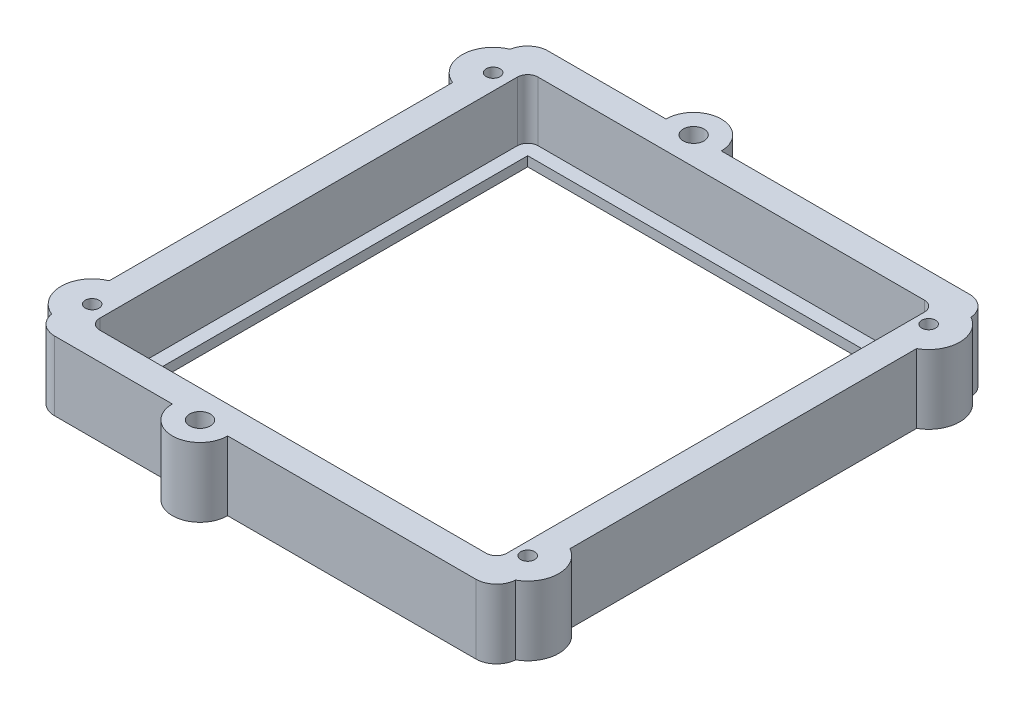
ISO-10303-21;
HEADER;
FILE_DESCRIPTION(('STEP AP214'),'2;1');
FILE_NAME('part.step','',(''),(''),'','','');
FILE_SCHEMA(('AUTOMOTIVE_DESIGN { 1 0 10303 214 1 1 1 1 }'));
ENDSEC;
DATA;
#1=APPLICATION_CONTEXT('core data for automotive mechanical design processes');
#2=APPLICATION_PROTOCOL_DEFINITION('international standard','automotive_design',2000,#1);
#3=PRODUCT_CONTEXT('',#1,'mechanical');
#4=PRODUCT('Part','Part','',(#3));
#5=PRODUCT_RELATED_PRODUCT_CATEGORY('part','',(#4));
#6=PRODUCT_DEFINITION_FORMATION('','',#4);
#7=PRODUCT_DEFINITION_CONTEXT('part definition',#1,'design');
#8=PRODUCT_DEFINITION('design','',#6,#7);
#9=PRODUCT_DEFINITION_SHAPE('','',#8);
#10=(LENGTH_UNIT() NAMED_UNIT(*) SI_UNIT(.MILLI.,.METRE.));
#11=(NAMED_UNIT(*) PLANE_ANGLE_UNIT() SI_UNIT($,.RADIAN.));
#12=(NAMED_UNIT(*) SI_UNIT($,.STERADIAN.) SOLID_ANGLE_UNIT());
#13=UNCERTAINTY_MEASURE_WITH_UNIT(LENGTH_MEASURE(1.E-05),#10,'distance_accuracy_value','');
#14=(GEOMETRIC_REPRESENTATION_CONTEXT(3) GLOBAL_UNCERTAINTY_ASSIGNED_CONTEXT((#13)) GLOBAL_UNIT_ASSIGNED_CONTEXT((#10,
#11,#12)) REPRESENTATION_CONTEXT('',''));
#15=CARTESIAN_POINT('',(0.,0.,0.));
#16=DIRECTION('',(0.,0.,1.));
#17=DIRECTION('',(1.,0.,0.));
#18=AXIS2_PLACEMENT_3D('',#15,#16,#17);
#19=CARTESIAN_POINT('',(1.50000000000001,10.,61.9));
#20=DIRECTION('',(0.,-1.,0.));
#21=DIRECTION('',(0.,0.,-1.));
#22=AXIS2_PLACEMENT_3D('',#19,#20,#21);
#23=CYLINDRICAL_SURFACE('',#22,1.5);
#24=DIRECTION('',(0.,-1.,0.));
#25=VECTOR('',#24,1.);
#26=CARTESIAN_POINT('',(1.50000000000002,10.,63.4));
#27=LINE('',#26,#25);
#28=CARTESIAN_POINT('',(1.50000000000002,10.,63.4));
#29=VERTEX_POINT('',#28);
#30=CARTESIAN_POINT('',(1.50000000000002,1.4,63.4));
#31=VERTEX_POINT('',#30);
#32=EDGE_CURVE('E337',#29,#31,#27,.T.);
#33=ORIENTED_EDGE('',*,*,#32,.T.);
#34=CARTESIAN_POINT('',(1.50000000000001,1.4,61.9));
#35=DIRECTION('',(0.,-1.,0.));
#36=DIRECTION('',(0.,0.,-1.));
#37=AXIS2_PLACEMENT_3D('',#34,#35,#36);
#38=CIRCLE('',#37,1.5);
#39=CARTESIAN_POINT('',(0.,1.4,61.9));
#40=VERTEX_POINT('',#39);
#41=EDGE_CURVE('E284',#31,#40,#38,.T.);
#42=ORIENTED_EDGE('',*,*,#41,.T.);
#43=DIRECTION('',(0.,-1.,0.));
#44=VECTOR('',#43,1.);
#45=CARTESIAN_POINT('',(0.,10.,61.9));
#46=LINE('',#45,#44);
#47=CARTESIAN_POINT('',(0.,10.,61.9));
#48=VERTEX_POINT('',#47);
#49=EDGE_CURVE('E316',#48,#40,#46,.T.);
#50=ORIENTED_EDGE('',*,*,#49,.F.);
#51=CARTESIAN_POINT('',(1.50000000000001,10.,61.9));
#52=DIRECTION('',(0.,1.,0.));
#53=DIRECTION('',(0.,0.,1.));
#54=AXIS2_PLACEMENT_3D('',#51,#52,#53);
#55=CIRCLE('',#54,1.5);
#56=EDGE_CURVE('E297',#48,#29,#55,.T.);
#57=ORIENTED_EDGE('',*,*,#56,.T.);
#58=EDGE_LOOP('',(#33,#42,#50,#57));
#59=FACE_BOUND('',#58,.T.);
#60=ADVANCED_FACE('F39',(#59),#23,.F.);
#61=CARTESIAN_POINT('',(1.50000000000002,10.,63.4));
#62=DIRECTION('',(0.,0.,-1.));
#63=DIRECTION('',(-1.,0.,0.));
#64=AXIS2_PLACEMENT_3D('',#61,#62,#63);
#65=PLANE('',#64);
#66=DIRECTION('',(0.,-1.,0.));
#67=VECTOR('',#66,1.);
#68=CARTESIAN_POINT('',(57.3857142857141,10.,63.4));
#69=LINE('',#68,#67);
#70=CARTESIAN_POINT('',(57.3857142857141,10.,63.4));
#71=VERTEX_POINT('',#70);
#72=CARTESIAN_POINT('',(57.3857142857141,1.4,63.4));
#73=VERTEX_POINT('',#72);
#74=EDGE_CURVE('E334',#71,#73,#69,.T.);
#75=ORIENTED_EDGE('',*,*,#74,.T.);
#76=DIRECTION('',(-1.,0.,0.));
#77=VECTOR('',#76,1.);
#78=CARTESIAN_POINT('',(0.,1.4,63.4));
#79=LINE('',#78,#77);
#80=EDGE_CURVE('E272',#73,#31,#79,.T.);
#81=ORIENTED_EDGE('',*,*,#80,.T.);
#82=ORIENTED_EDGE('',*,*,#32,.F.);
#83=DIRECTION('',(1.,0.,0.));
#84=VECTOR('',#83,1.);
#85=CARTESIAN_POINT('',(1.50000000000002,10.,63.4));
#86=LINE('',#85,#84);
#87=EDGE_CURVE('E301',#29,#71,#86,.T.);
#88=ORIENTED_EDGE('',*,*,#87,.T.);
#89=EDGE_LOOP('',(#75,#81,#82,#88));
#90=FACE_BOUND('',#89,.T.);
#91=ADVANCED_FACE('F556',(#90),#65,.T.);
#92=CARTESIAN_POINT('',(57.3857142857141,10.,61.9));
#93=DIRECTION('',(0.,-1.,0.));
#94=DIRECTION('',(0.,0.,-1.));
#95=AXIS2_PLACEMENT_3D('',#92,#93,#94);
#96=CYLINDRICAL_SURFACE('',#95,1.50000000000001);
#97=DIRECTION('',(0.,-1.,0.));
#98=VECTOR('',#97,1.);
#99=CARTESIAN_POINT('',(58.8857142857141,10.,61.9));
#100=LINE('',#99,#98);
#101=CARTESIAN_POINT('',(58.8857142857141,10.,61.9));
#102=VERTEX_POINT('',#101);
#103=CARTESIAN_POINT('',(58.8857142857141,1.4,61.9));
#104=VERTEX_POINT('',#103);
#105=EDGE_CURVE('E331',#102,#104,#100,.T.);
#106=ORIENTED_EDGE('',*,*,#105,.T.);
#107=CARTESIAN_POINT('',(57.3857142857141,1.4,61.9));
#108=DIRECTION('',(0.,-1.,0.));
#109=DIRECTION('',(0.,0.,-1.));
#110=AXIS2_PLACEMENT_3D('',#107,#108,#109);
#111=CIRCLE('',#110,1.50000000000001);
#112=EDGE_CURVE('E281',#104,#73,#111,.T.);
#113=ORIENTED_EDGE('',*,*,#112,.T.);
#114=ORIENTED_EDGE('',*,*,#74,.F.);
#115=CARTESIAN_POINT('',(57.3857142857141,10.,61.9));
#116=DIRECTION('',(0.,1.,0.));
#117=DIRECTION('',(0.,0.,1.));
#118=AXIS2_PLACEMENT_3D('',#115,#116,#117);
#119=CIRCLE('',#118,1.50000000000001);
#120=EDGE_CURVE('E303',#71,#102,#119,.T.);
#121=ORIENTED_EDGE('',*,*,#120,.T.);
#122=EDGE_LOOP('',(#106,#113,#114,#121));
#123=FACE_BOUND('',#122,.T.);
#124=ADVANCED_FACE('F562',(#123),#96,.F.);
#125=CARTESIAN_POINT('',(58.8857142857141,10.,1.5));
#126=DIRECTION('',(-1.,0.,0.));
#127=DIRECTION('',(0.,0.,1.));
#128=AXIS2_PLACEMENT_3D('',#125,#126,#127);
#129=PLANE('',#128);
#130=DIRECTION('',(0.,-1.,0.));
#131=VECTOR('',#130,1.);
#132=CARTESIAN_POINT('',(58.8857142857141,10.,1.5));
#133=LINE('',#132,#131);
#134=CARTESIAN_POINT('',(58.8857142857141,10.,1.5));
#135=VERTEX_POINT('',#134);
#136=CARTESIAN_POINT('',(58.8857142857141,1.4,1.5));
#137=VERTEX_POINT('',#136);
#138=EDGE_CURVE('E328',#135,#137,#133,.T.);
#139=ORIENTED_EDGE('',*,*,#138,.T.);
#140=DIRECTION('',(0.,0.,1.));
#141=VECTOR('',#140,1.);
#142=CARTESIAN_POINT('',(58.8857142857141,1.4,63.4));
#143=LINE('',#142,#141);
#144=EDGE_CURVE('E269',#137,#104,#143,.T.);
#145=ORIENTED_EDGE('',*,*,#144,.T.);
#146=ORIENTED_EDGE('',*,*,#105,.F.);
#147=DIRECTION('',(0.,0.,-1.));
#148=VECTOR('',#147,1.);
#149=CARTESIAN_POINT('',(58.8857142857141,10.,1.5));
#150=LINE('',#149,#148);
#151=EDGE_CURVE('E305',#102,#135,#150,.T.);
#152=ORIENTED_EDGE('',*,*,#151,.T.);
#153=EDGE_LOOP('',(#139,#145,#146,#152));
#154=FACE_BOUND('',#153,.T.);
#155=ADVANCED_FACE('F656',(#154),#129,.T.);
#156=CARTESIAN_POINT('',(57.3857142857141,10.,1.5));
#157=DIRECTION('',(0.,-1.,0.));
#158=DIRECTION('',(0.,0.,-1.));
#159=AXIS2_PLACEMENT_3D('',#156,#157,#158);
#160=CYLINDRICAL_SURFACE('',#159,1.5);
#161=DIRECTION('',(0.,-1.,0.));
#162=VECTOR('',#161,1.);
#163=CARTESIAN_POINT('',(57.3857142857141,10.,0.));
#164=LINE('',#163,#162);
#165=CARTESIAN_POINT('',(57.3857142857141,10.,0.));
#166=VERTEX_POINT('',#165);
#167=CARTESIAN_POINT('',(57.3857142857141,1.4,0.));
#168=VERTEX_POINT('',#167);
#169=EDGE_CURVE('E325',#166,#168,#164,.T.);
#170=ORIENTED_EDGE('',*,*,#169,.T.);
#171=CARTESIAN_POINT('',(57.3857142857141,1.4,1.5));
#172=DIRECTION('',(0.,-1.,0.));
#173=DIRECTION('',(0.,0.,-1.));
#174=AXIS2_PLACEMENT_3D('',#171,#172,#173);
#175=CIRCLE('',#174,1.5);
#176=EDGE_CURVE('E278',#168,#137,#175,.T.);
#177=ORIENTED_EDGE('',*,*,#176,.T.);
#178=ORIENTED_EDGE('',*,*,#138,.F.);
#179=CARTESIAN_POINT('',(57.3857142857141,10.,1.5));
#180=DIRECTION('',(0.,1.,0.));
#181=DIRECTION('',(0.,0.,-1.));
#182=AXIS2_PLACEMENT_3D('',#179,#180,#181);
#183=CIRCLE('',#182,1.5);
#184=EDGE_CURVE('E307',#135,#166,#183,.T.);
#185=ORIENTED_EDGE('',*,*,#184,.T.);
#186=EDGE_LOOP('',(#170,#177,#178,#185));
#187=FACE_BOUND('',#186,.T.);
#188=ADVANCED_FACE('F652',(#187),#160,.F.);
#189=CARTESIAN_POINT('',(1.50000000000001,10.,0.));
#190=DIRECTION('',(0.,0.,1.));
#191=DIRECTION('',(1.,0.,0.));
#192=AXIS2_PLACEMENT_3D('',#189,#190,#191);
#193=PLANE('',#192);
#194=DIRECTION('',(0.,-1.,0.));
#195=VECTOR('',#194,1.);
#196=CARTESIAN_POINT('',(1.50000000000001,10.,0.));
#197=LINE('',#196,#195);
#198=CARTESIAN_POINT('',(1.50000000000001,10.,0.));
#199=VERTEX_POINT('',#198);
#200=CARTESIAN_POINT('',(1.5,1.4,0.));
#201=VERTEX_POINT('',#200);
#202=EDGE_CURVE('E322',#199,#201,#197,.T.);
#203=ORIENTED_EDGE('',*,*,#202,.T.);
#204=DIRECTION('',(1.,0.,0.));
#205=VECTOR('',#204,1.);
#206=CARTESIAN_POINT('',(0.,1.4,0.));
#207=LINE('',#206,#205);
#208=EDGE_CURVE('E263',#201,#168,#207,.T.);
#209=ORIENTED_EDGE('',*,*,#208,.T.);
#210=ORIENTED_EDGE('',*,*,#169,.F.);
#211=DIRECTION('',(-1.,0.,0.));
#212=VECTOR('',#211,1.);
#213=CARTESIAN_POINT('',(1.50000000000001,10.,0.));
#214=LINE('',#213,#212);
#215=EDGE_CURVE('E309',#166,#199,#214,.T.);
#216=ORIENTED_EDGE('',*,*,#215,.T.);
#217=EDGE_LOOP('',(#203,#209,#210,#216));
#218=FACE_BOUND('',#217,.T.);
#219=ADVANCED_FACE('F648',(#218),#193,.T.);
#220=CARTESIAN_POINT('',(1.5,10.,1.5));
#221=DIRECTION('',(0.,-1.,0.));
#222=DIRECTION('',(0.,0.,-1.));
#223=AXIS2_PLACEMENT_3D('',#220,#221,#222);
#224=CYLINDRICAL_SURFACE('',#223,1.5);
#225=DIRECTION('',(0.,-1.,0.));
#226=VECTOR('',#225,1.);
#227=CARTESIAN_POINT('',(0.,10.,1.50000000000001));
#228=LINE('',#227,#226);
#229=CARTESIAN_POINT('',(0.,10.,1.50000000000001));
#230=VERTEX_POINT('',#229);
#231=CARTESIAN_POINT('',(0.,1.4,1.50000000000001));
#232=VERTEX_POINT('',#231);
#233=EDGE_CURVE('E319',#230,#232,#228,.T.);
#234=ORIENTED_EDGE('',*,*,#233,.T.);
#235=CARTESIAN_POINT('',(1.5,1.4,1.5));
#236=DIRECTION('',(0.,-1.,0.));
#237=DIRECTION('',(0.,0.,-1.));
#238=AXIS2_PLACEMENT_3D('',#235,#236,#237);
#239=CIRCLE('',#238,1.5);
#240=EDGE_CURVE('E275',#232,#201,#239,.T.);
#241=ORIENTED_EDGE('',*,*,#240,.T.);
#242=ORIENTED_EDGE('',*,*,#202,.F.);
#243=CARTESIAN_POINT('',(1.5,10.,1.5));
#244=DIRECTION('',(0.,1.,0.));
#245=DIRECTION('',(0.,0.,1.));
#246=AXIS2_PLACEMENT_3D('',#243,#244,#245);
#247=CIRCLE('',#246,1.5);
#248=EDGE_CURVE('E311',#199,#230,#247,.T.);
#249=ORIENTED_EDGE('',*,*,#248,.T.);
#250=EDGE_LOOP('',(#234,#241,#242,#249));
#251=FACE_BOUND('',#250,.T.);
#252=ADVANCED_FACE('F644',(#251),#224,.F.);
#253=CARTESIAN_POINT('',(0.,10.,1.50000000000001));
#254=DIRECTION('',(1.,0.,0.));
#255=DIRECTION('',(0.,0.,-1.));
#256=AXIS2_PLACEMENT_3D('',#253,#254,#255);
#257=PLANE('',#256);
#258=ORIENTED_EDGE('',*,*,#49,.T.);
#259=DIRECTION('',(0.,0.,-1.));
#260=VECTOR('',#259,1.);
#261=CARTESIAN_POINT('',(0.,1.4,1.50000000000001));
#262=LINE('',#261,#260);
#263=EDGE_CURVE('E452',#40,#232,#262,.T.);
#264=ORIENTED_EDGE('',*,*,#263,.T.);
#265=ORIENTED_EDGE('',*,*,#233,.F.);
#266=DIRECTION('',(0.,0.,1.));
#267=VECTOR('',#266,1.);
#268=CARTESIAN_POINT('',(0.,10.,1.50000000000001));
#269=LINE('',#268,#267);
#270=EDGE_CURVE('E314',#230,#48,#269,.T.);
#271=ORIENTED_EDGE('',*,*,#270,.T.);
#272=EDGE_LOOP('',(#258,#264,#265,#271));
#273=FACE_BOUND('',#272,.T.);
#274=ADVANCED_FACE('F586',(#273),#257,.T.);
#275=CARTESIAN_POINT('',(-2.3,10.,2.7));
#276=DIRECTION('',(0.,1.,0.));
#277=DIRECTION('',(0.,0.,1.));
#278=AXIS2_PLACEMENT_3D('',#275,#276,#277);
#279=PLANE('',#278);
#280=CARTESIAN_POINT('',(20.,10.,67.4));
#281=DIRECTION('',(0.,1.,0.));
#282=DIRECTION('',(0.,0.,1.));
#283=AXIS2_PLACEMENT_3D('',#280,#281,#282);
#284=CIRCLE('',#283,1.5);
#285=CARTESIAN_POINT('',(20.,10.,68.9));
#286=VERTEX_POINT('',#285);
#287=EDGE_CURVE('E294',#286,#286,#284,.T.);
#288=ORIENTED_EDGE('',*,*,#287,.F.);
#289=EDGE_LOOP('',(#288));
#290=FACE_BOUND('',#289,.T.);
#291=CARTESIAN_POINT('',(60.7,10.,60.7));
#292=DIRECTION('',(0.,1.,0.));
#293=DIRECTION('',(0.,0.,1.));
#294=AXIS2_PLACEMENT_3D('',#291,#292,#293);
#295=CIRCLE('',#294,0.999999999999998);
#296=CARTESIAN_POINT('',(60.7,10.,61.7));
#297=VERTEX_POINT('',#296);
#298=EDGE_CURVE('E347',#297,#297,#295,.T.);
#299=ORIENTED_EDGE('',*,*,#298,.F.);
#300=EDGE_LOOP('',(#299));
#301=FACE_BOUND('',#300,.T.);
#302=CARTESIAN_POINT('',(-2.3,10.,2.7));
#303=DIRECTION('',(0.,1.,0.));
#304=DIRECTION('',(0.,0.,1.));
#305=AXIS2_PLACEMENT_3D('',#302,#303,#304);
#306=CIRCLE('',#305,1.);
#307=CARTESIAN_POINT('',(-2.3,10.,3.7));
#308=VERTEX_POINT('',#307);
#309=EDGE_CURVE('E359',#308,#308,#306,.T.);
#310=ORIENTED_EDGE('',*,*,#309,.F.);
#311=EDGE_LOOP('',(#310));
#312=FACE_BOUND('',#311,.T.);
#313=DIRECTION('',(1.,0.,0.));
#314=VECTOR('',#313,1.);
#315=CARTESIAN_POINT('',(24.,10.,67.4));
#316=LINE('',#315,#314);
#317=CARTESIAN_POINT('',(24.,10.,67.4));
#318=VERTEX_POINT('',#317);
#319=CARTESIAN_POINT('',(59.8948174222634,10.,67.4));
#320=VERTEX_POINT('',#319);
#321=EDGE_CURVE('E376',#318,#320,#316,.T.);
#322=ORIENTED_EDGE('',*,*,#321,.T.);
#323=CARTESIAN_POINT('',(59.8948174222634,10.,64.4));
#324=DIRECTION('',(0.,1.,0.));
#325=DIRECTION('',(0.,0.,1.));
#326=AXIS2_PLACEMENT_3D('',#323,#324,#325);
#327=CIRCLE('',#326,3.);
#328=CARTESIAN_POINT('',(62.8857142857141,10.,64.6335293390577));
#329=VERTEX_POINT('',#328);
#330=EDGE_CURVE('E470',#320,#329,#327,.T.);
#331=ORIENTED_EDGE('',*,*,#330,.T.);
#332=CARTESIAN_POINT('',(60.7000000000006,10.,60.7));
#333=DIRECTION('',(0.,1.,0.));
#334=DIRECTION('',(0.,0.,1.));
#335=AXIS2_PLACEMENT_3D('',#332,#333,#334);
#336=CIRCLE('',#335,4.5);
#337=CARTESIAN_POINT('',(62.8857142857141,10.,56.7664706609423));
#338=VERTEX_POINT('',#337);
#339=EDGE_CURVE('E379',#329,#338,#336,.T.);
#340=ORIENTED_EDGE('',*,*,#339,.T.);
#341=DIRECTION('',(0.,0.,-1.));
#342=VECTOR('',#341,1.);
#343=CARTESIAN_POINT('',(62.8857142857141,10.,6.63352933905738));
#344=LINE('',#343,#342);
#345=CARTESIAN_POINT('',(62.8857142857141,10.,6.63352933905738));
#346=VERTEX_POINT('',#345);
#347=EDGE_CURVE('E381',#338,#346,#344,.T.);
#348=ORIENTED_EDGE('',*,*,#347,.T.);
#349=CARTESIAN_POINT('',(60.7,10.,2.7));
#350=DIRECTION('',(0.,1.,0.));
#351=DIRECTION('',(0.,0.,1.));
#352=AXIS2_PLACEMENT_3D('',#349,#350,#351);
#353=CIRCLE('',#352,4.5);
#354=CARTESIAN_POINT('',(62.8857142857141,10.,-1.23352933905738));
#355=VERTEX_POINT('',#354);
#356=EDGE_CURVE('E383',#346,#355,#353,.T.);
#357=ORIENTED_EDGE('',*,*,#356,.T.);
#358=CARTESIAN_POINT('',(59.8948174222634,10.,-1.));
#359=DIRECTION('',(0.,1.,0.));
#360=DIRECTION('',(0.,0.,1.));
#361=AXIS2_PLACEMENT_3D('',#358,#359,#360);
#362=CIRCLE('',#361,3.);
#363=CARTESIAN_POINT('',(59.8948174222634,10.,-4.));
#364=VERTEX_POINT('',#363);
#365=EDGE_CURVE('E60',#355,#364,#362,.T.);
#366=ORIENTED_EDGE('',*,*,#365,.T.);
#367=DIRECTION('',(-1.,0.,0.));
#368=VECTOR('',#367,1.);
#369=CARTESIAN_POINT('',(24.,10.,-4.));
#370=LINE('',#369,#368);
#371=CARTESIAN_POINT('',(24.,10.,-4.));
#372=VERTEX_POINT('',#371);
#373=EDGE_CURVE('E385',#364,#372,#370,.T.);
#374=ORIENTED_EDGE('',*,*,#373,.T.);
#375=CARTESIAN_POINT('',(20.,10.,-4.));
#376=DIRECTION('',(0.,1.,0.));
#377=DIRECTION('',(0.,0.,1.));
#378=AXIS2_PLACEMENT_3D('',#375,#376,#377);
#379=CIRCLE('',#378,4.);
#380=CARTESIAN_POINT('',(16.,10.,-4.));
#381=VERTEX_POINT('',#380);
#382=EDGE_CURVE('E387',#372,#381,#379,.T.);
#383=ORIENTED_EDGE('',*,*,#382,.T.);
#384=DIRECTION('',(-1.,0.,0.));
#385=VECTOR('',#384,1.);
#386=CARTESIAN_POINT('',(-4.,10.,-4.));
#387=LINE('',#386,#385);
#388=CARTESIAN_POINT('',(-1.03649757029297,10.,-4.));
#389=VERTEX_POINT('',#388);
#390=EDGE_CURVE('E389',#381,#389,#387,.T.);
#391=ORIENTED_EDGE('',*,*,#390,.T.);
#392=CARTESIAN_POINT('',(-1.03649757029297,10.,-1.));
#393=DIRECTION('',(0.,1.,0.));
#394=DIRECTION('',(0.,0.,1.));
#395=AXIS2_PLACEMENT_3D('',#392,#393,#394);
#396=CIRCLE('',#395,3.);
#397=CARTESIAN_POINT('',(-4.,10.,-1.46653333119993));
#398=VERTEX_POINT('',#397);
#399=EDGE_CURVE('E465',#389,#398,#396,.T.);
#400=ORIENTED_EDGE('',*,*,#399,.T.);
#401=CARTESIAN_POINT('',(-2.3,10.,2.7));
#402=DIRECTION('',(0.,1.,0.));
#403=DIRECTION('',(0.,0.,1.));
#404=AXIS2_PLACEMENT_3D('',#401,#402,#403);
#405=CIRCLE('',#404,4.5);
#406=CARTESIAN_POINT('',(-4.,10.,6.86653333119993));
#407=VERTEX_POINT('',#406);
#408=EDGE_CURVE('E365',#398,#407,#405,.T.);
#409=ORIENTED_EDGE('',*,*,#408,.T.);
#410=DIRECTION('',(0.,0.,1.));
#411=VECTOR('',#410,1.);
#412=CARTESIAN_POINT('',(-4.,10.,6.86653333119993));
#413=LINE('',#412,#411);
#414=CARTESIAN_POINT('',(-3.99999999999999,10.,56.5334666688003));
#415=VERTEX_POINT('',#414);
#416=EDGE_CURVE('E367',#407,#415,#413,.T.);
#417=ORIENTED_EDGE('',*,*,#416,.T.);
#418=CARTESIAN_POINT('',(-2.29999999999939,10.,60.7));
#419=DIRECTION('',(0.,1.,0.));
#420=DIRECTION('',(0.,0.,1.));
#421=AXIS2_PLACEMENT_3D('',#418,#419,#420);
#422=CIRCLE('',#421,4.5);
#423=CARTESIAN_POINT('',(-3.99999999999999,10.,64.8665333311997));
#424=VERTEX_POINT('',#423);
#425=EDGE_CURVE('E370',#415,#424,#422,.T.);
#426=ORIENTED_EDGE('',*,*,#425,.T.);
#427=CARTESIAN_POINT('',(-1.03649757029292,10.,64.4));
#428=DIRECTION('',(0.,1.,0.));
#429=DIRECTION('',(0.,0.,1.));
#430=AXIS2_PLACEMENT_3D('',#427,#428,#429);
#431=CIRCLE('',#430,3.);
#432=CARTESIAN_POINT('',(-1.03649757029292,10.,67.4));
#433=VERTEX_POINT('',#432);
#434=EDGE_CURVE('E468',#424,#433,#431,.T.);
#435=ORIENTED_EDGE('',*,*,#434,.T.);
#436=DIRECTION('',(1.,0.,0.));
#437=VECTOR('',#436,1.);
#438=CARTESIAN_POINT('',(-3.99999999999999,10.,67.4));
#439=LINE('',#438,#437);
#440=CARTESIAN_POINT('',(16.,10.,67.4));
#441=VERTEX_POINT('',#440);
#442=EDGE_CURVE('E372',#433,#441,#439,.T.);
#443=ORIENTED_EDGE('',*,*,#442,.T.);
#444=CARTESIAN_POINT('',(20.,10.,67.4));
#445=DIRECTION('',(0.,1.,0.));
#446=DIRECTION('',(0.,0.,1.));
#447=AXIS2_PLACEMENT_3D('',#444,#445,#446);
#448=CIRCLE('',#447,4.);
#449=EDGE_CURVE('E374',#441,#318,#448,.T.);
#450=ORIENTED_EDGE('',*,*,#449,.T.);
#451=EDGE_LOOP('',(#322,#331,#340,#348,#357,#366,#374,#383,#391,#400,#409,#417,#426,#435,#443,#450));
#452=FACE_BOUND('',#451,.T.);
#453=CARTESIAN_POINT('',(60.7,10.,2.7));
#454=DIRECTION('',(0.,1.,0.));
#455=DIRECTION('',(0.,0.,1.));
#456=AXIS2_PLACEMENT_3D('',#453,#454,#455);
#457=CIRCLE('',#456,0.999999999999998);
#458=CARTESIAN_POINT('',(60.7,10.,3.7));
#459=VERTEX_POINT('',#458);
#460=EDGE_CURVE('E353',#459,#459,#457,.T.);
#461=ORIENTED_EDGE('',*,*,#460,.F.);
#462=EDGE_LOOP('',(#461));
#463=FACE_BOUND('',#462,.T.);
#464=CARTESIAN_POINT('',(-2.3,10.,60.7));
#465=DIRECTION('',(0.,1.,0.));
#466=DIRECTION('',(0.,0.,1.));
#467=AXIS2_PLACEMENT_3D('',#464,#465,#466);
#468=CIRCLE('',#467,1.);
#469=CARTESIAN_POINT('',(-2.3,10.,61.7));
#470=VERTEX_POINT('',#469);
#471=EDGE_CURVE('E341',#470,#470,#468,.T.);
#472=ORIENTED_EDGE('',*,*,#471,.F.);
#473=EDGE_LOOP('',(#472));
#474=FACE_BOUND('',#473,.T.);
#475=ORIENTED_EDGE('',*,*,#87,.F.);
#476=ORIENTED_EDGE('',*,*,#56,.F.);
#477=ORIENTED_EDGE('',*,*,#270,.F.);
#478=ORIENTED_EDGE('',*,*,#248,.F.);
#479=ORIENTED_EDGE('',*,*,#215,.F.);
#480=ORIENTED_EDGE('',*,*,#184,.F.);
#481=ORIENTED_EDGE('',*,*,#151,.F.);
#482=ORIENTED_EDGE('',*,*,#120,.F.);
#483=EDGE_LOOP('',(#475,#476,#477,#478,#479,#480,#481,#482));
#484=FACE_BOUND('',#483,.T.);
#485=CARTESIAN_POINT('',(20.,10.,-4.));
#486=DIRECTION('',(0.,1.,0.));
#487=DIRECTION('',(0.,0.,1.));
#488=AXIS2_PLACEMENT_3D('',#485,#486,#487);
#489=CIRCLE('',#488,1.5);
#490=CARTESIAN_POINT('',(20.,10.,-2.5));
#491=VERTEX_POINT('',#490);
#492=EDGE_CURVE('E288',#491,#491,#489,.T.);
#493=ORIENTED_EDGE('',*,*,#492,.F.);
#494=EDGE_LOOP('',(#493));
#495=FACE_BOUND('',#494,.T.);
#496=ADVANCED_FACE('F494',(#290,#301,#312,#452,#463,#474,#484,#495),#279,.T.);
#497=CARTESIAN_POINT('',(-2.3,0.,2.7));
#498=DIRECTION('',(0.,1.,0.));
#499=DIRECTION('',(0.,0.,1.));
#500=AXIS2_PLACEMENT_3D('',#497,#498,#499);
#501=PLANE('',#500);
#502=CARTESIAN_POINT('',(-2.3,0.,60.7));
#503=DIRECTION('',(0.,1.,0.));
#504=DIRECTION('',(0.,0.,1.));
#505=AXIS2_PLACEMENT_3D('',#502,#503,#504);
#506=CIRCLE('',#505,1.);
#507=CARTESIAN_POINT('',(-2.3,0.,61.7));
#508=VERTEX_POINT('',#507);
#509=EDGE_CURVE('E340',#508,#508,#506,.T.);
#510=ORIENTED_EDGE('',*,*,#509,.T.);
#511=EDGE_LOOP('',(#510));
#512=FACE_BOUND('',#511,.T.);
#513=CARTESIAN_POINT('',(60.7,0.,60.7));
#514=DIRECTION('',(0.,1.,0.));
#515=DIRECTION('',(0.,0.,1.));
#516=AXIS2_PLACEMENT_3D('',#513,#514,#515);
#517=CIRCLE('',#516,0.999999999999998);
#518=CARTESIAN_POINT('',(60.7,0.,61.7));
#519=VERTEX_POINT('',#518);
#520=EDGE_CURVE('E344',#519,#519,#517,.T.);
#521=ORIENTED_EDGE('',*,*,#520,.T.);
#522=EDGE_LOOP('',(#521));
#523=FACE_BOUND('',#522,.T.);
#524=CARTESIAN_POINT('',(60.7,0.,2.7));
#525=DIRECTION('',(0.,1.,0.));
#526=DIRECTION('',(0.,0.,1.));
#527=AXIS2_PLACEMENT_3D('',#524,#525,#526);
#528=CIRCLE('',#527,0.999999999999998);
#529=CARTESIAN_POINT('',(60.7,0.,3.7));
#530=VERTEX_POINT('',#529);
#531=EDGE_CURVE('E350',#530,#530,#528,.T.);
#532=ORIENTED_EDGE('',*,*,#531,.T.);
#533=EDGE_LOOP('',(#532));
#534=FACE_BOUND('',#533,.T.);
#535=CARTESIAN_POINT('',(-2.3,0.,2.7));
#536=DIRECTION('',(0.,1.,0.));
#537=DIRECTION('',(0.,0.,1.));
#538=AXIS2_PLACEMENT_3D('',#535,#536,#537);
#539=CIRCLE('',#538,1.);
#540=CARTESIAN_POINT('',(-2.3,0.,3.7));
#541=VERTEX_POINT('',#540);
#542=EDGE_CURVE('E356',#541,#541,#539,.T.);
#543=ORIENTED_EDGE('',*,*,#542,.T.);
#544=EDGE_LOOP('',(#543));
#545=FACE_BOUND('',#544,.T.);
#546=CARTESIAN_POINT('',(60.7000000000006,0.,60.7));
#547=DIRECTION('',(0.,1.,0.));
#548=DIRECTION('',(0.,0.,1.));
#549=AXIS2_PLACEMENT_3D('',#546,#547,#548);
#550=CIRCLE('',#549,4.5);
#551=CARTESIAN_POINT('',(62.8857142857141,0.,64.6335293390577));
#552=VERTEX_POINT('',#551);
#553=CARTESIAN_POINT('',(62.8857142857141,0.,56.7664706609423));
#554=VERTEX_POINT('',#553);
#555=EDGE_CURVE('E405',#552,#554,#550,.T.);
#556=ORIENTED_EDGE('',*,*,#555,.F.);
#557=CARTESIAN_POINT('',(59.8948174222634,0.,64.4));
#558=DIRECTION('',(0.,1.,0.));
#559=DIRECTION('',(0.,0.,1.));
#560=AXIS2_PLACEMENT_3D('',#557,#558,#559);
#561=CIRCLE('',#560,3.);
#562=CARTESIAN_POINT('',(59.8948174222634,0.,67.4));
#563=VERTEX_POINT('',#562);
#564=EDGE_CURVE('E461',#552,#563,#561,.F.);
#565=ORIENTED_EDGE('',*,*,#564,.T.);
#566=DIRECTION('',(1.,0.,0.));
#567=VECTOR('',#566,1.);
#568=CARTESIAN_POINT('',(24.,0.,67.4));
#569=LINE('',#568,#567);
#570=CARTESIAN_POINT('',(24.,0.,67.4));
#571=VERTEX_POINT('',#570);
#572=EDGE_CURVE('E402',#571,#563,#569,.T.);
#573=ORIENTED_EDGE('',*,*,#572,.F.);
#574=CARTESIAN_POINT('',(20.,0.,67.4));
#575=DIRECTION('',(0.,1.,0.));
#576=DIRECTION('',(0.,0.,1.));
#577=AXIS2_PLACEMENT_3D('',#574,#575,#576);
#578=CIRCLE('',#577,4.);
#579=CARTESIAN_POINT('',(16.,0.,67.4));
#580=VERTEX_POINT('',#579);
#581=EDGE_CURVE('E400',#580,#571,#578,.T.);
#582=ORIENTED_EDGE('',*,*,#581,.F.);
#583=DIRECTION('',(1.,0.,0.));
#584=VECTOR('',#583,1.);
#585=CARTESIAN_POINT('',(-3.99999999999999,0.,67.4));
#586=LINE('',#585,#584);
#587=CARTESIAN_POINT('',(-1.03649757029292,0.,67.4));
#588=VERTEX_POINT('',#587);
#589=EDGE_CURVE('E398',#588,#580,#586,.T.);
#590=ORIENTED_EDGE('',*,*,#589,.F.);
#591=CARTESIAN_POINT('',(-1.03649757029292,0.,64.4));
#592=DIRECTION('',(0.,1.,0.));
#593=DIRECTION('',(0.,0.,1.));
#594=AXIS2_PLACEMENT_3D('',#591,#592,#593);
#595=CIRCLE('',#594,3.);
#596=CARTESIAN_POINT('',(-3.99999999999999,0.,64.8665333311997));
#597=VERTEX_POINT('',#596);
#598=EDGE_CURVE('E459',#588,#597,#595,.F.);
#599=ORIENTED_EDGE('',*,*,#598,.T.);
#600=CARTESIAN_POINT('',(-2.29999999999939,0.,60.7));
#601=DIRECTION('',(0.,1.,0.));
#602=DIRECTION('',(0.,0.,1.));
#603=AXIS2_PLACEMENT_3D('',#600,#601,#602);
#604=CIRCLE('',#603,4.5);
#605=CARTESIAN_POINT('',(-3.99999999999999,0.,56.5334666688003));
#606=VERTEX_POINT('',#605);
#607=EDGE_CURVE('E395',#606,#597,#604,.T.);
#608=ORIENTED_EDGE('',*,*,#607,.F.);
#609=DIRECTION('',(0.,0.,1.));
#610=VECTOR('',#609,1.);
#611=CARTESIAN_POINT('',(-4.,0.,6.86653333119993));
#612=LINE('',#611,#610);
#613=CARTESIAN_POINT('',(-4.,0.,6.86653333119993));
#614=VERTEX_POINT('',#613);
#615=EDGE_CURVE('E393',#614,#606,#612,.T.);
#616=ORIENTED_EDGE('',*,*,#615,.F.);
#617=CARTESIAN_POINT('',(-2.3,0.,2.7));
#618=DIRECTION('',(0.,1.,0.));
#619=DIRECTION('',(0.,0.,1.));
#620=AXIS2_PLACEMENT_3D('',#617,#618,#619);
#621=CIRCLE('',#620,4.5);
#622=CARTESIAN_POINT('',(-4.,0.,-1.46653333119993));
#623=VERTEX_POINT('',#622);
#624=EDGE_CURVE('E362',#623,#614,#621,.T.);
#625=ORIENTED_EDGE('',*,*,#624,.F.);
#626=CARTESIAN_POINT('',(-1.03649757029297,0.,-1.));
#627=DIRECTION('',(0.,1.,0.));
#628=DIRECTION('',(0.,0.,1.));
#629=AXIS2_PLACEMENT_3D('',#626,#627,#628);
#630=CIRCLE('',#629,3.);
#631=CARTESIAN_POINT('',(-1.03649757029297,0.,-4.));
#632=VERTEX_POINT('',#631);
#633=EDGE_CURVE('E455',#623,#632,#630,.F.);
#634=ORIENTED_EDGE('',*,*,#633,.T.);
#635=DIRECTION('',(-1.,0.,0.));
#636=VECTOR('',#635,1.);
#637=CARTESIAN_POINT('',(-4.,0.,-4.));
#638=LINE('',#637,#636);
#639=CARTESIAN_POINT('',(16.,0.,-4.));
#640=VERTEX_POINT('',#639);
#641=EDGE_CURVE('E368',#640,#632,#638,.T.);
#642=ORIENTED_EDGE('',*,*,#641,.F.);
#643=CARTESIAN_POINT('',(20.,0.,-4.));
#644=DIRECTION('',(0.,1.,0.));
#645=DIRECTION('',(0.,0.,1.));
#646=AXIS2_PLACEMENT_3D('',#643,#644,#645);
#647=CIRCLE('',#646,4.);
#648=CARTESIAN_POINT('',(24.,0.,-4.));
#649=VERTEX_POINT('',#648);
#650=EDGE_CURVE('E414',#649,#640,#647,.T.);
#651=ORIENTED_EDGE('',*,*,#650,.F.);
#652=DIRECTION('',(-1.,0.,0.));
#653=VECTOR('',#652,1.);
#654=CARTESIAN_POINT('',(24.,0.,-4.));
#655=LINE('',#654,#653);
#656=CARTESIAN_POINT('',(59.8948174222634,0.,-4.));
#657=VERTEX_POINT('',#656);
#658=EDGE_CURVE('E412',#657,#649,#655,.T.);
#659=ORIENTED_EDGE('',*,*,#658,.F.);
#660=CARTESIAN_POINT('',(59.8948174222634,0.,-1.));
#661=DIRECTION('',(0.,1.,0.));
#662=DIRECTION('',(0.,0.,1.));
#663=AXIS2_PLACEMENT_3D('',#660,#661,#662);
#664=CIRCLE('',#663,3.);
#665=CARTESIAN_POINT('',(62.8857142857141,0.,-1.23352933905738));
#666=VERTEX_POINT('',#665);
#667=EDGE_CURVE('E457',#657,#666,#664,.F.);
#668=ORIENTED_EDGE('',*,*,#667,.T.);
#669=CARTESIAN_POINT('',(60.7,0.,2.7));
#670=DIRECTION('',(0.,1.,0.));
#671=DIRECTION('',(0.,0.,1.));
#672=AXIS2_PLACEMENT_3D('',#669,#670,#671);
#673=CIRCLE('',#672,4.5);
#674=CARTESIAN_POINT('',(62.8857142857141,0.,6.63352933905738));
#675=VERTEX_POINT('',#674);
#676=EDGE_CURVE('E409',#675,#666,#673,.T.);
#677=ORIENTED_EDGE('',*,*,#676,.F.);
#678=DIRECTION('',(0.,0.,-1.));
#679=VECTOR('',#678,1.);
#680=CARTESIAN_POINT('',(62.8857142857141,0.,6.63352933905738));
#681=LINE('',#680,#679);
#682=EDGE_CURVE('E407',#554,#675,#681,.T.);
#683=ORIENTED_EDGE('',*,*,#682,.F.);
#684=EDGE_LOOP('',(#556,#565,#573,#582,#590,#599,#608,#616,#625,#634,#642,#651,#659,#668,#677,#683));
#685=FACE_BOUND('',#684,.T.);
#686=CARTESIAN_POINT('',(20.,0.,67.4));
#687=DIRECTION('',(0.,1.,0.));
#688=DIRECTION('',(0.,0.,1.));
#689=AXIS2_PLACEMENT_3D('',#686,#687,#688);
#690=CIRCLE('',#689,1.5);
#691=CARTESIAN_POINT('',(20.,0.,68.9));
#692=VERTEX_POINT('',#691);
#693=EDGE_CURVE('E291',#692,#692,#690,.T.);
#694=ORIENTED_EDGE('',*,*,#693,.T.);
#695=EDGE_LOOP('',(#694));
#696=FACE_BOUND('',#695,.T.);
#697=CARTESIAN_POINT('',(20.,0.,-4.));
#698=DIRECTION('',(0.,1.,0.));
#699=DIRECTION('',(0.,0.,1.));
#700=AXIS2_PLACEMENT_3D('',#697,#698,#699);
#701=CIRCLE('',#700,1.5);
#702=CARTESIAN_POINT('',(20.,0.,-2.5));
#703=VERTEX_POINT('',#702);
#704=EDGE_CURVE('E287',#703,#703,#701,.T.);
#705=ORIENTED_EDGE('',*,*,#704,.T.);
#706=EDGE_LOOP('',(#705));
#707=FACE_BOUND('',#706,.T.);
#708=DIRECTION('',(-1.,0.,0.));
#709=VECTOR('',#708,1.);
#710=CARTESIAN_POINT('',(2.,0.,61.4));
#711=LINE('',#710,#709);
#712=CARTESIAN_POINT('',(56.8857142857141,0.,61.4));
#713=VERTEX_POINT('',#712);
#714=CARTESIAN_POINT('',(2.,0.,61.4));
#715=VERTEX_POINT('',#714);
#716=EDGE_CURVE('E231',#713,#715,#711,.T.);
#717=ORIENTED_EDGE('',*,*,#716,.F.);
#718=DIRECTION('',(0.,0.,1.));
#719=VECTOR('',#718,1.);
#720=CARTESIAN_POINT('',(56.8857142857141,0.,61.4));
#721=LINE('',#720,#719);
#722=CARTESIAN_POINT('',(56.8857142857141,0.,2.));
#723=VERTEX_POINT('',#722);
#724=EDGE_CURVE('E248',#723,#713,#721,.T.);
#725=ORIENTED_EDGE('',*,*,#724,.F.);
#726=DIRECTION('',(1.,0.,0.));
#727=VECTOR('',#726,1.);
#728=CARTESIAN_POINT('',(2.00000000000001,0.,2.));
#729=LINE('',#728,#727);
#730=CARTESIAN_POINT('',(2.00000000000001,0.,2.));
#731=VERTEX_POINT('',#730);
#732=EDGE_CURVE('E251',#731,#723,#729,.T.);
#733=ORIENTED_EDGE('',*,*,#732,.F.);
#734=DIRECTION('',(0.,0.,-1.));
#735=VECTOR('',#734,1.);
#736=CARTESIAN_POINT('',(2.,0.,61.4));
#737=LINE('',#736,#735);
#738=EDGE_CURVE('E257',#715,#731,#737,.T.);
#739=ORIENTED_EDGE('',*,*,#738,.F.);
#740=EDGE_LOOP('',(#717,#725,#733,#739));
#741=FACE_BOUND('',#740,.T.);
#742=ADVANCED_FACE('F484',(#512,#523,#534,#545,#685,#696,#707,#741),#501,.F.);
#743=CARTESIAN_POINT('',(-2.3,10.,2.7));
#744=DIRECTION('',(0.,-1.,0.));
#745=DIRECTION('',(0.,0.,-1.));
#746=AXIS2_PLACEMENT_3D('',#743,#744,#745);
#747=CYLINDRICAL_SURFACE('',#746,4.5);
#748=ORIENTED_EDGE('',*,*,#624,.T.);
#749=DIRECTION('',(0.,-1.,0.));
#750=VECTOR('',#749,1.);
#751=CARTESIAN_POINT('',(-4.,10.,6.86653333119993));
#752=LINE('',#751,#750);
#753=EDGE_CURVE('E446',#407,#614,#752,.T.);
#754=ORIENTED_EDGE('',*,*,#753,.F.);
#755=ORIENTED_EDGE('',*,*,#408,.F.);
#756=DIRECTION('',(0.,-1.,0.));
#757=VECTOR('',#756,1.);
#758=CARTESIAN_POINT('',(-4.,10.,-1.46653333119993));
#759=LINE('',#758,#757);
#760=EDGE_CURVE('E449',#398,#623,#759,.T.);
#761=ORIENTED_EDGE('',*,*,#760,.T.);
#762=EDGE_LOOP('',(#748,#754,#755,#761));
#763=FACE_BOUND('',#762,.T.);
#764=ADVANCED_FACE('F501',(#763),#747,.T.);
#765=CARTESIAN_POINT('',(-4.,10.,6.86653333119993));
#766=DIRECTION('',(1.,0.,0.));
#767=DIRECTION('',(0.,0.,-1.));
#768=AXIS2_PLACEMENT_3D('',#765,#766,#767);
#769=PLANE('',#768);
#770=ORIENTED_EDGE('',*,*,#615,.T.);
#771=DIRECTION('',(0.,-1.,0.));
#772=VECTOR('',#771,1.);
#773=CARTESIAN_POINT('',(-3.99999999999999,10.,56.5334666688003));
#774=LINE('',#773,#772);
#775=EDGE_CURVE('E443',#415,#606,#774,.T.);
#776=ORIENTED_EDGE('',*,*,#775,.F.);
#777=ORIENTED_EDGE('',*,*,#416,.F.);
#778=ORIENTED_EDGE('',*,*,#753,.T.);
#779=EDGE_LOOP('',(#770,#776,#777,#778));
#780=FACE_BOUND('',#779,.T.);
#781=ADVANCED_FACE('F508',(#780),#769,.F.);
#782=CARTESIAN_POINT('',(-2.29999999999939,10.,60.7));
#783=DIRECTION('',(0.,-1.,0.));
#784=DIRECTION('',(0.,0.,-1.));
#785=AXIS2_PLACEMENT_3D('',#782,#783,#784);
#786=CYLINDRICAL_SURFACE('',#785,4.5);
#787=ORIENTED_EDGE('',*,*,#607,.T.);
#788=DIRECTION('',(0.,-1.,0.));
#789=VECTOR('',#788,1.);
#790=CARTESIAN_POINT('',(-3.99999999999999,10.,64.8665333311997));
#791=LINE('',#790,#789);
#792=EDGE_CURVE('E440',#424,#597,#791,.T.);
#793=ORIENTED_EDGE('',*,*,#792,.F.);
#794=ORIENTED_EDGE('',*,*,#425,.F.);
#795=ORIENTED_EDGE('',*,*,#775,.T.);
#796=EDGE_LOOP('',(#787,#793,#794,#795));
#797=FACE_BOUND('',#796,.T.);
#798=ADVANCED_FACE('F512',(#797),#786,.T.);
#799=CARTESIAN_POINT('',(-3.99999999999999,10.,67.4));
#800=DIRECTION('',(0.,0.,-1.));
#801=DIRECTION('',(-1.,0.,0.));
#802=AXIS2_PLACEMENT_3D('',#799,#800,#801);
#803=PLANE('',#802);
#804=ORIENTED_EDGE('',*,*,#442,.F.);
#805=DIRECTION('',(0.,-1.,0.));
#806=VECTOR('',#805,1.);
#807=CARTESIAN_POINT('',(-1.03649757029292,10.,67.4));
#808=LINE('',#807,#806);
#809=EDGE_CURVE('E472',#433,#588,#808,.T.);
#810=ORIENTED_EDGE('',*,*,#809,.T.);
#811=ORIENTED_EDGE('',*,*,#589,.T.);
#812=DIRECTION('',(0.,-1.,0.));
#813=VECTOR('',#812,1.);
#814=CARTESIAN_POINT('',(16.,10.,67.4));
#815=LINE('',#814,#813);
#816=EDGE_CURVE('E437',#441,#580,#815,.T.);
#817=ORIENTED_EDGE('',*,*,#816,.F.);
#818=EDGE_LOOP('',(#804,#810,#811,#817));
#819=FACE_BOUND('',#818,.T.);
#820=ADVANCED_FACE('F520',(#819),#803,.F.);
#821=CARTESIAN_POINT('',(20.,10.,67.4));
#822=DIRECTION('',(0.,-1.,0.));
#823=DIRECTION('',(0.,0.,-1.));
#824=AXIS2_PLACEMENT_3D('',#821,#822,#823);
#825=CYLINDRICAL_SURFACE('',#824,4.);
#826=ORIENTED_EDGE('',*,*,#581,.T.);
#827=DIRECTION('',(0.,-1.,0.));
#828=VECTOR('',#827,1.);
#829=CARTESIAN_POINT('',(24.,10.,67.4));
#830=LINE('',#829,#828);
#831=EDGE_CURVE('E434',#318,#571,#830,.T.);
#832=ORIENTED_EDGE('',*,*,#831,.F.);
#833=ORIENTED_EDGE('',*,*,#449,.F.);
#834=ORIENTED_EDGE('',*,*,#816,.T.);
#835=EDGE_LOOP('',(#826,#832,#833,#834));
#836=FACE_BOUND('',#835,.T.);
#837=ADVANCED_FACE('F526',(#836),#825,.T.);
#838=CARTESIAN_POINT('',(24.,10.,67.4));
#839=DIRECTION('',(0.,0.,-1.));
#840=DIRECTION('',(-1.,0.,0.));
#841=AXIS2_PLACEMENT_3D('',#838,#839,#840);
#842=PLANE('',#841);
#843=ORIENTED_EDGE('',*,*,#572,.T.);
#844=DIRECTION('',(0.,-1.,0.));
#845=VECTOR('',#844,1.);
#846=CARTESIAN_POINT('',(59.8948174222634,10.,67.4));
#847=LINE('',#846,#845);
#848=EDGE_CURVE('E463',#563,#320,#847,.F.);
#849=ORIENTED_EDGE('',*,*,#848,.T.);
#850=ORIENTED_EDGE('',*,*,#321,.F.);
#851=ORIENTED_EDGE('',*,*,#831,.T.);
#852=EDGE_LOOP('',(#843,#849,#850,#851));
#853=FACE_BOUND('',#852,.T.);
#854=ADVANCED_FACE('F603',(#853),#842,.F.);
#855=CARTESIAN_POINT('',(60.7000000000006,10.,60.7));
#856=DIRECTION('',(0.,-1.,0.));
#857=DIRECTION('',(0.,0.,-1.));
#858=AXIS2_PLACEMENT_3D('',#855,#856,#857);
#859=CYLINDRICAL_SURFACE('',#858,4.5);
#860=ORIENTED_EDGE('',*,*,#555,.T.);
#861=DIRECTION('',(0.,-1.,0.));
#862=VECTOR('',#861,1.);
#863=CARTESIAN_POINT('',(62.8857142857141,10.,56.7664706609423));
#864=LINE('',#863,#862);
#865=EDGE_CURVE('E428',#338,#554,#864,.T.);
#866=ORIENTED_EDGE('',*,*,#865,.F.);
#867=ORIENTED_EDGE('',*,*,#339,.F.);
#868=DIRECTION('',(0.,-1.,0.));
#869=VECTOR('',#868,1.);
#870=CARTESIAN_POINT('',(62.8857142857141,10.,64.6335293390577));
#871=LINE('',#870,#869);
#872=EDGE_CURVE('E431',#329,#552,#871,.T.);
#873=ORIENTED_EDGE('',*,*,#872,.T.);
#874=EDGE_LOOP('',(#860,#866,#867,#873));
#875=FACE_BOUND('',#874,.T.);
#876=ADVANCED_FACE('F536',(#875),#859,.T.);
#877=CARTESIAN_POINT('',(62.8857142857141,10.,6.63352933905738));
#878=DIRECTION('',(-1.,0.,0.));
#879=DIRECTION('',(0.,0.,1.));
#880=AXIS2_PLACEMENT_3D('',#877,#878,#879);
#881=PLANE('',#880);
#882=ORIENTED_EDGE('',*,*,#682,.T.);
#883=DIRECTION('',(0.,-1.,0.));
#884=VECTOR('',#883,1.);
#885=CARTESIAN_POINT('',(62.8857142857141,10.,6.63352933905738));
#886=LINE('',#885,#884);
#887=EDGE_CURVE('E425',#346,#675,#886,.T.);
#888=ORIENTED_EDGE('',*,*,#887,.F.);
#889=ORIENTED_EDGE('',*,*,#347,.F.);
#890=ORIENTED_EDGE('',*,*,#865,.T.);
#891=EDGE_LOOP('',(#882,#888,#889,#890));
#892=FACE_BOUND('',#891,.T.);
#893=ADVANCED_FACE('F542',(#892),#881,.F.);
#894=CARTESIAN_POINT('',(60.7,10.,2.7));
#895=DIRECTION('',(0.,-1.,0.));
#896=DIRECTION('',(0.,0.,-1.));
#897=AXIS2_PLACEMENT_3D('',#894,#895,#896);
#898=CYLINDRICAL_SURFACE('',#897,4.5);
#899=ORIENTED_EDGE('',*,*,#676,.T.);
#900=DIRECTION('',(0.,-1.,0.));
#901=VECTOR('',#900,1.);
#902=CARTESIAN_POINT('',(62.8857142857141,10.,-1.23352933905738));
#903=LINE('',#902,#901);
#904=EDGE_CURVE('E422',#355,#666,#903,.T.);
#905=ORIENTED_EDGE('',*,*,#904,.F.);
#906=ORIENTED_EDGE('',*,*,#356,.F.);
#907=ORIENTED_EDGE('',*,*,#887,.T.);
#908=EDGE_LOOP('',(#899,#905,#906,#907));
#909=FACE_BOUND('',#908,.T.);
#910=ADVANCED_FACE('F546',(#909),#898,.T.);
#911=CARTESIAN_POINT('',(24.,10.,-4.));
#912=DIRECTION('',(0.,0.,1.));
#913=DIRECTION('',(1.,0.,0.));
#914=AXIS2_PLACEMENT_3D('',#911,#912,#913);
#915=PLANE('',#914);
#916=ORIENTED_EDGE('',*,*,#373,.F.);
#917=DIRECTION('',(0.,-1.,0.));
#918=VECTOR('',#917,1.);
#919=CARTESIAN_POINT('',(59.8948174222634,10.,-4.));
#920=LINE('',#919,#918);
#921=EDGE_CURVE('E47',#364,#657,#920,.T.);
#922=ORIENTED_EDGE('',*,*,#921,.T.);
#923=ORIENTED_EDGE('',*,*,#658,.T.);
#924=DIRECTION('',(0.,-1.,0.));
#925=VECTOR('',#924,1.);
#926=CARTESIAN_POINT('',(24.,10.,-4.));
#927=LINE('',#926,#925);
#928=EDGE_CURVE('E419',#372,#649,#927,.T.);
#929=ORIENTED_EDGE('',*,*,#928,.F.);
#930=EDGE_LOOP('',(#916,#922,#923,#929));
#931=FACE_BOUND('',#930,.T.);
#932=ADVANCED_FACE('F478',(#931),#915,.F.);
#933=CARTESIAN_POINT('',(20.,10.,-4.));
#934=DIRECTION('',(0.,-1.,0.));
#935=DIRECTION('',(0.,0.,-1.));
#936=AXIS2_PLACEMENT_3D('',#933,#934,#935);
#937=CYLINDRICAL_SURFACE('',#936,4.);
#938=ORIENTED_EDGE('',*,*,#650,.T.);
#939=DIRECTION('',(0.,-1.,0.));
#940=VECTOR('',#939,1.);
#941=CARTESIAN_POINT('',(16.,10.,-4.));
#942=LINE('',#941,#940);
#943=EDGE_CURVE('E391',#381,#640,#942,.T.);
#944=ORIENTED_EDGE('',*,*,#943,.F.);
#945=ORIENTED_EDGE('',*,*,#382,.F.);
#946=ORIENTED_EDGE('',*,*,#928,.T.);
#947=EDGE_LOOP('',(#938,#944,#945,#946));
#948=FACE_BOUND('',#947,.T.);
#949=ADVANCED_FACE('F490',(#948),#937,.T.);
#950=CARTESIAN_POINT('',(-4.,10.,-4.));
#951=DIRECTION('',(0.,0.,1.));
#952=DIRECTION('',(1.,0.,0.));
#953=AXIS2_PLACEMENT_3D('',#950,#951,#952);
#954=PLANE('',#953);
#955=ORIENTED_EDGE('',*,*,#641,.T.);
#956=DIRECTION('',(0.,-1.,0.));
#957=VECTOR('',#956,1.);
#958=CARTESIAN_POINT('',(-1.03649757029297,10.,-4.));
#959=LINE('',#958,#957);
#960=EDGE_CURVE('E11',#632,#389,#959,.F.);
#961=ORIENTED_EDGE('',*,*,#960,.T.);
#962=ORIENTED_EDGE('',*,*,#390,.F.);
#963=ORIENTED_EDGE('',*,*,#943,.T.);
#964=EDGE_LOOP('',(#955,#961,#962,#963));
#965=FACE_BOUND('',#964,.T.);
#966=ADVANCED_FACE('F492',(#965),#954,.F.);
#967=CARTESIAN_POINT('',(-2.3,10.,2.7));
#968=DIRECTION('',(0.,-1.,0.));
#969=DIRECTION('',(0.,0.,-1.));
#970=AXIS2_PLACEMENT_3D('',#967,#968,#969);
#971=CYLINDRICAL_SURFACE('',#970,1.);
#972=ORIENTED_EDGE('',*,*,#309,.T.);
#973=EDGE_LOOP('',(#972));
#974=FACE_BOUND('',#973,.T.);
#975=ORIENTED_EDGE('',*,*,#542,.F.);
#976=EDGE_LOOP('',(#975));
#977=FACE_BOUND('',#976,.T.);
#978=ADVANCED_FACE('F579',(#974,#977),#971,.F.);
#979=CARTESIAN_POINT('',(60.7,10.,2.7));
#980=DIRECTION('',(0.,-1.,0.));
#981=DIRECTION('',(0.,0.,-1.));
#982=AXIS2_PLACEMENT_3D('',#979,#980,#981);
#983=CYLINDRICAL_SURFACE('',#982,0.999999999999998);
#984=ORIENTED_EDGE('',*,*,#460,.T.);
#985=EDGE_LOOP('',(#984));
#986=FACE_BOUND('',#985,.T.);
#987=ORIENTED_EDGE('',*,*,#531,.F.);
#988=EDGE_LOOP('',(#987));
#989=FACE_BOUND('',#988,.T.);
#990=ADVANCED_FACE('F575',(#986,#989),#983,.F.);
#991=CARTESIAN_POINT('',(60.7,10.,60.7));
#992=DIRECTION('',(0.,-1.,0.));
#993=DIRECTION('',(0.,0.,-1.));
#994=AXIS2_PLACEMENT_3D('',#991,#992,#993);
#995=CYLINDRICAL_SURFACE('',#994,0.999999999999998);
#996=ORIENTED_EDGE('',*,*,#298,.T.);
#997=EDGE_LOOP('',(#996));
#998=FACE_BOUND('',#997,.T.);
#999=ORIENTED_EDGE('',*,*,#520,.F.);
#1000=EDGE_LOOP('',(#999));
#1001=FACE_BOUND('',#1000,.T.);
#1002=ADVANCED_FACE('F571',(#998,#1001),#995,.F.);
#1003=CARTESIAN_POINT('',(-2.3,10.,60.7));
#1004=DIRECTION('',(0.,-1.,0.));
#1005=DIRECTION('',(0.,0.,-1.));
#1006=AXIS2_PLACEMENT_3D('',#1003,#1004,#1005);
#1007=CYLINDRICAL_SURFACE('',#1006,1.);
#1008=ORIENTED_EDGE('',*,*,#471,.T.);
#1009=EDGE_LOOP('',(#1008));
#1010=FACE_BOUND('',#1009,.T.);
#1011=ORIENTED_EDGE('',*,*,#509,.F.);
#1012=EDGE_LOOP('',(#1011));
#1013=FACE_BOUND('',#1012,.T.);
#1014=ADVANCED_FACE('F567',(#1010,#1013),#1007,.F.);
#1015=CARTESIAN_POINT('',(20.,10.,67.4));
#1016=DIRECTION('',(0.,-1.,0.));
#1017=DIRECTION('',(0.,0.,-1.));
#1018=AXIS2_PLACEMENT_3D('',#1015,#1016,#1017);
#1019=CYLINDRICAL_SURFACE('',#1018,1.5);
#1020=ORIENTED_EDGE('',*,*,#287,.T.);
#1021=EDGE_LOOP('',(#1020));
#1022=FACE_BOUND('',#1021,.T.);
#1023=ORIENTED_EDGE('',*,*,#693,.F.);
#1024=EDGE_LOOP('',(#1023));
#1025=FACE_BOUND('',#1024,.T.);
#1026=ADVANCED_FACE('F570',(#1022,#1025),#1019,.F.);
#1027=CARTESIAN_POINT('',(20.,10.,-4.));
#1028=DIRECTION('',(0.,-1.,0.));
#1029=DIRECTION('',(0.,0.,-1.));
#1030=AXIS2_PLACEMENT_3D('',#1027,#1028,#1029);
#1031=CYLINDRICAL_SURFACE('',#1030,1.5);
#1032=ORIENTED_EDGE('',*,*,#492,.T.);
#1033=EDGE_LOOP('',(#1032));
#1034=FACE_BOUND('',#1033,.T.);
#1035=ORIENTED_EDGE('',*,*,#704,.F.);
#1036=EDGE_LOOP('',(#1035));
#1037=FACE_BOUND('',#1036,.T.);
#1038=ADVANCED_FACE('F634',(#1034,#1037),#1031,.F.);
#1039=CARTESIAN_POINT('',(0.,1.4,0.));
#1040=DIRECTION('',(0.,-1.,0.));
#1041=DIRECTION('',(0.,0.,-1.));
#1042=AXIS2_PLACEMENT_3D('',#1039,#1040,#1041);
#1043=PLANE('',#1042);
#1044=ORIENTED_EDGE('',*,*,#41,.F.);
#1045=ORIENTED_EDGE('',*,*,#80,.F.);
#1046=ORIENTED_EDGE('',*,*,#112,.F.);
#1047=ORIENTED_EDGE('',*,*,#144,.F.);
#1048=ORIENTED_EDGE('',*,*,#176,.F.);
#1049=ORIENTED_EDGE('',*,*,#208,.F.);
#1050=ORIENTED_EDGE('',*,*,#240,.F.);
#1051=ORIENTED_EDGE('',*,*,#263,.F.);
#1052=EDGE_LOOP('',(#1044,#1045,#1046,#1047,#1048,#1049,#1050,#1051));
#1053=FACE_BOUND('',#1052,.T.);
#1054=DIRECTION('',(0.,0.,1.));
#1055=VECTOR('',#1054,1.);
#1056=CARTESIAN_POINT('',(56.8857142857141,1.4,61.4));
#1057=LINE('',#1056,#1055);
#1058=CARTESIAN_POINT('',(56.8857142857141,1.4,2.));
#1059=VERTEX_POINT('',#1058);
#1060=CARTESIAN_POINT('',(56.8857142857141,1.4,61.4));
#1061=VERTEX_POINT('',#1060);
#1062=EDGE_CURVE('E236',#1059,#1061,#1057,.T.);
#1063=ORIENTED_EDGE('',*,*,#1062,.T.);
#1064=DIRECTION('',(-1.,0.,0.));
#1065=VECTOR('',#1064,1.);
#1066=CARTESIAN_POINT('',(2.,1.4,61.4));
#1067=LINE('',#1066,#1065);
#1068=CARTESIAN_POINT('',(2.,1.4,61.4));
#1069=VERTEX_POINT('',#1068);
#1070=EDGE_CURVE('E228',#1061,#1069,#1067,.T.);
#1071=ORIENTED_EDGE('',*,*,#1070,.T.);
#1072=DIRECTION('',(0.,0.,-1.));
#1073=VECTOR('',#1072,1.);
#1074=CARTESIAN_POINT('',(2.,1.4,61.4));
#1075=LINE('',#1074,#1073);
#1076=CARTESIAN_POINT('',(2.00000000000001,1.4,2.));
#1077=VERTEX_POINT('',#1076);
#1078=EDGE_CURVE('E240',#1069,#1077,#1075,.T.);
#1079=ORIENTED_EDGE('',*,*,#1078,.T.);
#1080=DIRECTION('',(1.,0.,0.));
#1081=VECTOR('',#1080,1.);
#1082=CARTESIAN_POINT('',(2.00000000000001,1.4,2.));
#1083=LINE('',#1082,#1081);
#1084=EDGE_CURVE('E244',#1077,#1059,#1083,.T.);
#1085=ORIENTED_EDGE('',*,*,#1084,.T.);
#1086=EDGE_LOOP('',(#1063,#1071,#1079,#1085));
#1087=FACE_BOUND('',#1086,.T.);
#1088=ADVANCED_FACE('F246',(#1053,#1087),#1043,.F.);
#1089=CARTESIAN_POINT('',(2.,1.4,61.4));
#1090=DIRECTION('',(0.,0.,1.));
#1091=DIRECTION('',(1.,0.,0.));
#1092=AXIS2_PLACEMENT_3D('',#1089,#1090,#1091);
#1093=PLANE('',#1092);
#1094=ORIENTED_EDGE('',*,*,#716,.T.);
#1095=DIRECTION('',(0.,-1.,0.));
#1096=VECTOR('',#1095,1.);
#1097=CARTESIAN_POINT('',(2.,1.4,61.4));
#1098=LINE('',#1097,#1096);
#1099=EDGE_CURVE('E224',#1069,#715,#1098,.T.);
#1100=ORIENTED_EDGE('',*,*,#1099,.F.);
#1101=ORIENTED_EDGE('',*,*,#1070,.F.);
#1102=DIRECTION('',(0.,-1.,0.));
#1103=VECTOR('',#1102,1.);
#1104=CARTESIAN_POINT('',(56.8857142857141,1.4,61.4));
#1105=LINE('',#1104,#1103);
#1106=EDGE_CURVE('E261',#1061,#713,#1105,.T.);
#1107=ORIENTED_EDGE('',*,*,#1106,.T.);
#1108=EDGE_LOOP('',(#1094,#1100,#1101,#1107));
#1109=FACE_BOUND('',#1108,.T.);
#1110=ADVANCED_FACE('F226',(#1109),#1093,.F.);
#1111=CARTESIAN_POINT('',(56.8857142857141,1.4,61.4));
#1112=DIRECTION('',(1.,0.,0.));
#1113=DIRECTION('',(0.,0.,-1.));
#1114=AXIS2_PLACEMENT_3D('',#1111,#1112,#1113);
#1115=PLANE('',#1114);
#1116=ORIENTED_EDGE('',*,*,#724,.T.);
#1117=ORIENTED_EDGE('',*,*,#1106,.F.);
#1118=ORIENTED_EDGE('',*,*,#1062,.F.);
#1119=DIRECTION('',(0.,-1.,0.));
#1120=VECTOR('',#1119,1.);
#1121=CARTESIAN_POINT('',(56.8857142857141,1.4,2.));
#1122=LINE('',#1121,#1120);
#1123=EDGE_CURVE('E264',#1059,#723,#1122,.T.);
#1124=ORIENTED_EDGE('',*,*,#1123,.T.);
#1125=EDGE_LOOP('',(#1116,#1117,#1118,#1124));
#1126=FACE_BOUND('',#1125,.T.);
#1127=ADVANCED_FACE('F625',(#1126),#1115,.F.);
#1128=CARTESIAN_POINT('',(2.00000000000001,1.4,2.));
#1129=DIRECTION('',(0.,0.,-1.));
#1130=DIRECTION('',(-1.,0.,0.));
#1131=AXIS2_PLACEMENT_3D('',#1128,#1129,#1130);
#1132=PLANE('',#1131);
#1133=ORIENTED_EDGE('',*,*,#732,.T.);
#1134=ORIENTED_EDGE('',*,*,#1123,.F.);
#1135=ORIENTED_EDGE('',*,*,#1084,.F.);
#1136=DIRECTION('',(0.,-1.,0.));
#1137=VECTOR('',#1136,1.);
#1138=CARTESIAN_POINT('',(2.00000000000001,1.4,2.));
#1139=LINE('',#1138,#1137);
#1140=EDGE_CURVE('E235',#1077,#731,#1139,.T.);
#1141=ORIENTED_EDGE('',*,*,#1140,.T.);
#1142=EDGE_LOOP('',(#1133,#1134,#1135,#1141));
#1143=FACE_BOUND('',#1142,.T.);
#1144=ADVANCED_FACE('F620',(#1143),#1132,.F.);
#1145=CARTESIAN_POINT('',(2.,1.4,61.4));
#1146=DIRECTION('',(-1.,0.,0.));
#1147=DIRECTION('',(0.,0.,1.));
#1148=AXIS2_PLACEMENT_3D('',#1145,#1146,#1147);
#1149=PLANE('',#1148);
#1150=ORIENTED_EDGE('',*,*,#738,.T.);
#1151=ORIENTED_EDGE('',*,*,#1140,.F.);
#1152=ORIENTED_EDGE('',*,*,#1078,.F.);
#1153=ORIENTED_EDGE('',*,*,#1099,.T.);
#1154=EDGE_LOOP('',(#1150,#1151,#1152,#1153));
#1155=FACE_BOUND('',#1154,.T.);
#1156=ADVANCED_FACE('F241',(#1155),#1149,.F.);
#1157=CARTESIAN_POINT('',(59.8948174222634,10.,64.4));
#1158=DIRECTION('',(0.,-1.,0.));
#1159=DIRECTION('',(0.,0.,-1.));
#1160=AXIS2_PLACEMENT_3D('',#1157,#1158,#1159);
#1161=CYLINDRICAL_SURFACE('',#1160,3.);
#1162=ORIENTED_EDGE('',*,*,#330,.F.);
#1163=ORIENTED_EDGE('',*,*,#848,.F.);
#1164=ORIENTED_EDGE('',*,*,#564,.F.);
#1165=ORIENTED_EDGE('',*,*,#872,.F.);
#1166=EDGE_LOOP('',(#1162,#1163,#1164,#1165));
#1167=FACE_BOUND('',#1166,.T.);
#1168=ADVANCED_FACE('F534',(#1167),#1161,.T.);
#1169=CARTESIAN_POINT('',(-1.03649757029292,10.,64.4));
#1170=DIRECTION('',(0.,-1.,0.));
#1171=DIRECTION('',(0.,0.,-1.));
#1172=AXIS2_PLACEMENT_3D('',#1169,#1170,#1171);
#1173=CYLINDRICAL_SURFACE('',#1172,3.);
#1174=ORIENTED_EDGE('',*,*,#434,.F.);
#1175=ORIENTED_EDGE('',*,*,#792,.T.);
#1176=ORIENTED_EDGE('',*,*,#598,.F.);
#1177=ORIENTED_EDGE('',*,*,#809,.F.);
#1178=EDGE_LOOP('',(#1174,#1175,#1176,#1177));
#1179=FACE_BOUND('',#1178,.T.);
#1180=ADVANCED_FACE('F516',(#1179),#1173,.T.);
#1181=CARTESIAN_POINT('',(59.8948174222634,10.,-1.));
#1182=DIRECTION('',(0.,-1.,0.));
#1183=DIRECTION('',(0.,0.,-1.));
#1184=AXIS2_PLACEMENT_3D('',#1181,#1182,#1183);
#1185=CYLINDRICAL_SURFACE('',#1184,3.);
#1186=ORIENTED_EDGE('',*,*,#365,.F.);
#1187=ORIENTED_EDGE('',*,*,#904,.T.);
#1188=ORIENTED_EDGE('',*,*,#667,.F.);
#1189=ORIENTED_EDGE('',*,*,#921,.F.);
#1190=EDGE_LOOP('',(#1186,#1187,#1188,#1189));
#1191=FACE_BOUND('',#1190,.T.);
#1192=ADVANCED_FACE('F548',(#1191),#1185,.T.);
#1193=CARTESIAN_POINT('',(-1.03649757029297,10.,-1.));
#1194=DIRECTION('',(0.,-1.,0.));
#1195=DIRECTION('',(0.,0.,-1.));
#1196=AXIS2_PLACEMENT_3D('',#1193,#1194,#1195);
#1197=CYLINDRICAL_SURFACE('',#1196,3.);
#1198=ORIENTED_EDGE('',*,*,#399,.F.);
#1199=ORIENTED_EDGE('',*,*,#960,.F.);
#1200=ORIENTED_EDGE('',*,*,#633,.F.);
#1201=ORIENTED_EDGE('',*,*,#760,.F.);
#1202=EDGE_LOOP('',(#1198,#1199,#1200,#1201));
#1203=FACE_BOUND('',#1202,.T.);
#1204=ADVANCED_FACE('F41',(#1203),#1197,.T.);
#1205=CLOSED_SHELL('',(#60,#91,#124,#155,#188,#219,#252,#274,#496,#742,#764,#781,#798,#820,#837,
#854,#876,#893,#910,#932,#949,#966,#978,#990,#1002,#1014,#1026,#1038,#1088,#1110,#1127,#1144,
#1156,#1168,#1180,#1192,#1204));
#1206=MANIFOLD_SOLID_BREP('B2',#1205);
#1207=ADVANCED_BREP_SHAPE_REPRESENTATION('',(#18,#1206),#14);
#1208=SHAPE_DEFINITION_REPRESENTATION(#9,#1207);
ENDSEC;
END-ISO-10303-21;
